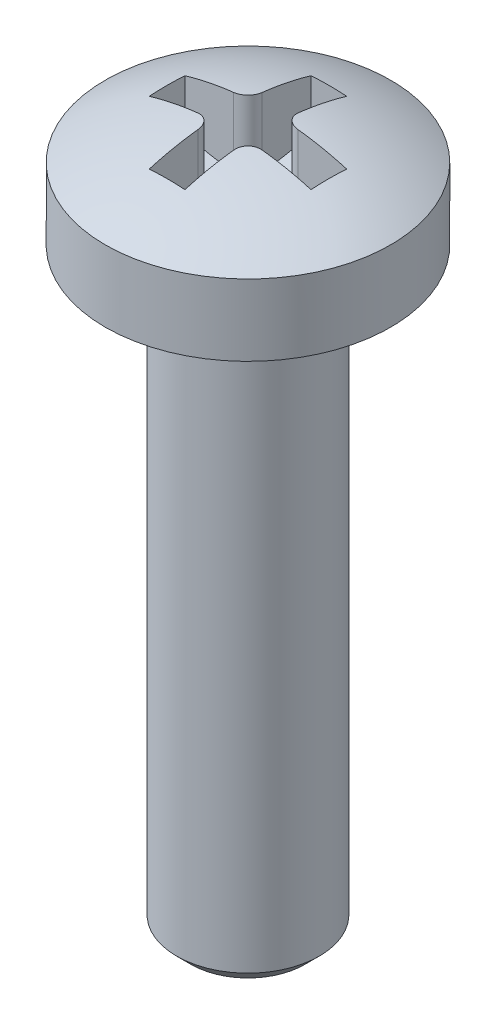
ISO-10303-21;
HEADER;
FILE_DESCRIPTION(('STEP AP214'),'2;1');
FILE_NAME('part.step','',(''),(''),'','','');
FILE_SCHEMA(('AUTOMOTIVE_DESIGN { 1 0 10303 214 1 1 1 1 }'));
ENDSEC;
DATA;
#1=APPLICATION_CONTEXT('core data for automotive mechanical design processes');
#2=APPLICATION_PROTOCOL_DEFINITION('international standard','automotive_design',2000,#1);
#3=PRODUCT_CONTEXT('',#1,'mechanical');
#4=PRODUCT('Part','Part','',(#3));
#5=PRODUCT_RELATED_PRODUCT_CATEGORY('part','',(#4));
#6=PRODUCT_DEFINITION_FORMATION('','',#4);
#7=PRODUCT_DEFINITION_CONTEXT('part definition',#1,'design');
#8=PRODUCT_DEFINITION('design','',#6,#7);
#9=PRODUCT_DEFINITION_SHAPE('','',#8);
#10=(LENGTH_UNIT() NAMED_UNIT(*) SI_UNIT(.MILLI.,.METRE.));
#11=(NAMED_UNIT(*) PLANE_ANGLE_UNIT() SI_UNIT($,.RADIAN.));
#12=(NAMED_UNIT(*) SI_UNIT($,.STERADIAN.) SOLID_ANGLE_UNIT());
#13=UNCERTAINTY_MEASURE_WITH_UNIT(LENGTH_MEASURE(1.E-05),#10,'distance_accuracy_value','');
#14=(GEOMETRIC_REPRESENTATION_CONTEXT(3) GLOBAL_UNCERTAINTY_ASSIGNED_CONTEXT((#13)) GLOBAL_UNIT_ASSIGNED_CONTEXT((#10,
#11,#12)) REPRESENTATION_CONTEXT('',''));
#15=CARTESIAN_POINT('',(0.,0.,0.));
#16=DIRECTION('',(0.,0.,1.));
#17=DIRECTION('',(1.,0.,0.));
#18=AXIS2_PLACEMENT_3D('',#15,#16,#17);
#19=CARTESIAN_POINT('',(3.,-25.,0.));
#20=DIRECTION('',(0.,1.,0.));
#21=DIRECTION('',(0.,0.,1.));
#22=AXIS2_PLACEMENT_3D('',#19,#20,#21);
#23=PLANE('',#22);
#24=CARTESIAN_POINT('',(0.,-25.,0.));
#25=DIRECTION('',(0.,1.,0.));
#26=DIRECTION('',(0.,0.,1.));
#27=AXIS2_PLACEMENT_3D('',#24,#25,#26);
#28=CIRCLE('',#27,2.40000000000001);
#29=CARTESIAN_POINT('',(0.,-25.,2.40000000000001));
#30=VERTEX_POINT('',#29);
#31=EDGE_CURVE('E11',#30,#30,#28,.F.);
#32=ORIENTED_EDGE('',*,*,#31,.T.);
#33=EDGE_LOOP('',(#32));
#34=FACE_BOUND('',#33,.T.);
#35=ADVANCED_FACE('F36',(#34),#23,.F.);
#36=CARTESIAN_POINT('',(0.,-7.44999999999999,0.));
#37=DIRECTION('',(0.,1.,0.));
#38=DIRECTION('',(1.,0.,0.));
#39=AXIS2_PLACEMENT_3D('',#36,#37,#38);
#40=SPHERICAL_SURFACE('',#39,12.05);
#41=CARTESIAN_POINT('',(0.75,-7.44999999999999,0.));
#42=DIRECTION('',(1.,0.,0.));
#43=DIRECTION('',(0.,0.,-1.));
#44=AXIS2_PLACEMENT_3D('',#41,#42,#43);
#45=CIRCLE('',#44,12.0266371026983);
#46=CARTESIAN_POINT('',(0.75,4.08603051313579,-3.4));
#47=VERTEX_POINT('',#46);
#48=CARTESIAN_POINT('',(0.75,4.50062759858243,-1.35));
#49=VERTEX_POINT('',#48);
#50=EDGE_CURVE('E194',#47,#49,#45,.T.);
#51=ORIENTED_EDGE('',*,*,#50,.T.);
#52=CARTESIAN_POINT('',(0.75,4.50062759858243,-1.35));
#53=CARTESIAN_POINT('',(0.749970698872697,4.50440889012492,-1.31655591255039));
#54=CARTESIAN_POINT('',(0.752794798026864,4.50786991911377,-1.28307795509376));
#55=CARTESIAN_POINT('',(0.763975275297831,4.51406552358367,-1.21700468922484));
#56=CARTESIAN_POINT('',(0.772329233355664,4.51680041611411,-1.18440900119309));
#57=CARTESIAN_POINT('',(0.79440353509289,4.52146303861642,-1.12099578071274));
#58=CARTESIAN_POINT('',(0.808127936309649,4.52339015600345,-1.09017961299683));
#59=CARTESIAN_POINT('',(0.840557266614517,4.52637706033217,-1.03125561276694));
#60=CARTESIAN_POINT('',(0.8592606546155,4.52743711523272,-1.00314694589195));
#61=CARTESIAN_POINT('',(0.900979469558403,4.52865432624304,-0.95062827208944));
#62=CARTESIAN_POINT('',(0.923964554523091,4.52881760325255,-0.926194301302964));
#63=CARTESIAN_POINT('',(0.973678414753883,4.52825275812473,-0.881492303520661));
#64=CARTESIAN_POINT('',(1.00040776840153,4.52752449813588,-0.861224921338421));
#65=CARTESIAN_POINT('',(1.05675110369052,4.52520195501556,-0.825485736308251));
#66=CARTESIAN_POINT('',(1.08635633111687,4.52361023640853,-0.809999944511885));
#67=CARTESIAN_POINT('',(1.14767285065154,4.51960909198419,-0.78416498760138));
#68=CARTESIAN_POINT('',(1.17938331676325,4.51719998536419,-0.773813821249108));
#69=CARTESIAN_POINT('',(1.23437039023693,4.51246564112583,-0.760785009950145));
#70=CARTESIAN_POINT('',(1.25734967707357,4.51032865006867,-0.756740661571654));
#71=CARTESIAN_POINT('',(1.30355584224305,4.50572101643025,-0.751347964421718));
#72=CARTESIAN_POINT('',(1.3267823190226,4.50325085589045,-0.749995764296765));
#73=CARTESIAN_POINT('',(1.35,4.50062759858243,-0.75));
#74=B_SPLINE_CURVE_WITH_KNOTS('',3,(#52,#53,#54,#55,#56,#57,#58,#59,#60,#61,#62,#63,#64,#65,#66,
#67,#68,#69,#70,#71,#72,#73),.UNSPECIFIED.,.F.,.F.,(4,2,2,2,2,2,2,2,2,2,4),(0.,
0.100848616189047,0.201653126662501,0.302533945598312,0.403383576314152,0.503544000910255,
0.603719914500104,0.703599915669478,0.803440957613562,0.873581021054327,0.943620670692784),.UNSPECIFIED.);
#75=CARTESIAN_POINT('',(1.35,4.50062759858243,-0.75));
#76=VERTEX_POINT('',#75);
#77=EDGE_CURVE('E256',#49,#76,#74,.T.);
#78=ORIENTED_EDGE('',*,*,#77,.T.);
#79=CARTESIAN_POINT('',(0.,-7.44999999999999,-0.75));
#80=DIRECTION('',(0.,0.,-1.));
#81=DIRECTION('',(-1.,0.,0.));
#82=AXIS2_PLACEMENT_3D('',#79,#80,#81);
#83=CIRCLE('',#82,12.0266371026983);
#84=CARTESIAN_POINT('',(3.4,4.08603051313579,-0.75));
#85=VERTEX_POINT('',#84);
#86=EDGE_CURVE('E192',#76,#85,#83,.T.);
#87=ORIENTED_EDGE('',*,*,#86,.T.);
#88=CARTESIAN_POINT('',(3.4,-7.44999999999999,0.));
#89=DIRECTION('',(1.,0.,0.));
#90=DIRECTION('',(0.,0.,-1.));
#91=AXIS2_PLACEMENT_3D('',#88,#89,#90);
#92=CIRCLE('',#91,11.5603849416877);
#93=CARTESIAN_POINT('',(3.4,4.08603051313579,0.75));
#94=VERTEX_POINT('',#93);
#95=EDGE_CURVE('E169',#85,#94,#92,.T.);
#96=ORIENTED_EDGE('',*,*,#95,.T.);
#97=CARTESIAN_POINT('',(0.,-7.44999999999999,0.75));
#98=DIRECTION('',(0.,0.,1.));
#99=DIRECTION('',(1.,0.,0.));
#100=AXIS2_PLACEMENT_3D('',#97,#98,#99);
#101=CIRCLE('',#100,12.0266371026983);
#102=CARTESIAN_POINT('',(1.35,4.50062759858243,0.75));
#103=VERTEX_POINT('',#102);
#104=EDGE_CURVE('E218',#94,#103,#101,.T.);
#105=ORIENTED_EDGE('',*,*,#104,.T.);
#106=CARTESIAN_POINT('',(1.35,4.50062759858243,0.75));
#107=CARTESIAN_POINT('',(1.31655591255039,4.50440889012492,0.749970698872697));
#108=CARTESIAN_POINT('',(1.28307795509376,4.50786991911377,0.752794798026864));
#109=CARTESIAN_POINT('',(1.21700468922484,4.51406552358367,0.763975275297831));
#110=CARTESIAN_POINT('',(1.18440900119309,4.51680041611411,0.772329233355664));
#111=CARTESIAN_POINT('',(1.12099578071274,4.52146303861642,0.79440353509289));
#112=CARTESIAN_POINT('',(1.09017961299683,4.52339015600345,0.808127936309649));
#113=CARTESIAN_POINT('',(1.03125561276694,4.52637706033217,0.840557266614517));
#114=CARTESIAN_POINT('',(1.00314694589195,4.52743711523272,0.8592606546155));
#115=CARTESIAN_POINT('',(0.95062827208944,4.52865432624304,0.900979469558403));
#116=CARTESIAN_POINT('',(0.926194301302965,4.52881760325255,0.923964554523091));
#117=CARTESIAN_POINT('',(0.881492303520662,4.52825275812473,0.973678414753883));
#118=CARTESIAN_POINT('',(0.861224921338422,4.52752449813588,1.00040776840153));
#119=CARTESIAN_POINT('',(0.825485736308252,4.52520195501556,1.05675110369052));
#120=CARTESIAN_POINT('',(0.809999944511885,4.52361023640853,1.08635633111687));
#121=CARTESIAN_POINT('',(0.784164987601381,4.51960909198419,1.14767285065154));
#122=CARTESIAN_POINT('',(0.773813821249109,4.51719998536419,1.17938331676325));
#123=CARTESIAN_POINT('',(0.760785009950146,4.51246564112583,1.23437039023693));
#124=CARTESIAN_POINT('',(0.756740661571655,4.51032865006867,1.25734967707357));
#125=CARTESIAN_POINT('',(0.751347964421719,4.50572101643025,1.30355584224305));
#126=CARTESIAN_POINT('',(0.749995764296766,4.50325085589045,1.3267823190226));
#127=CARTESIAN_POINT('',(0.750000000000001,4.50062759858243,1.35));
#128=B_SPLINE_CURVE_WITH_KNOTS('',3,(#106,#107,#108,#109,#110,#111,#112,#113,#114,#115,#116,
#117,#118,#119,#120,#121,#122,#123,#124,#125,#126,#127),.UNSPECIFIED.,.F.,.F.,(4,2,2,2,2,2,2,2,
2,2,4),(0.,0.100848616189047,0.201653126662501,0.302533945598312,0.403383576314151,
0.503544000910255,0.603719914500104,0.703599915669478,0.803440957613562,0.873581021054327,
0.943620670692784),.UNSPECIFIED.);
#129=CARTESIAN_POINT('',(0.75,4.50062759858243,1.35));
#130=VERTEX_POINT('',#129);
#131=EDGE_CURVE('E251',#103,#130,#128,.T.);
#132=ORIENTED_EDGE('',*,*,#131,.T.);
#133=CARTESIAN_POINT('',(0.75,-7.44999999999999,0.));
#134=DIRECTION('',(1.,0.,0.));
#135=DIRECTION('',(0.,0.,-1.));
#136=AXIS2_PLACEMENT_3D('',#133,#134,#135);
#137=CIRCLE('',#136,12.0266371026983);
#138=CARTESIAN_POINT('',(0.750000000000001,4.08603051313579,3.4));
#139=VERTEX_POINT('',#138);
#140=EDGE_CURVE('E216',#130,#139,#137,.T.);
#141=ORIENTED_EDGE('',*,*,#140,.T.);
#142=CARTESIAN_POINT('',(0.,-7.44999999999999,3.4));
#143=DIRECTION('',(0.,0.,1.));
#144=DIRECTION('',(1.,0.,0.));
#145=AXIS2_PLACEMENT_3D('',#142,#143,#144);
#146=CIRCLE('',#145,11.5603849416877);
#147=CARTESIAN_POINT('',(-0.75,4.08603051313579,3.4));
#148=VERTEX_POINT('',#147);
#149=EDGE_CURVE('E213',#139,#148,#146,.T.);
#150=ORIENTED_EDGE('',*,*,#149,.T.);
#151=CARTESIAN_POINT('',(-0.75,-7.44999999999999,0.));
#152=DIRECTION('',(-1.,0.,0.));
#153=DIRECTION('',(0.,0.,1.));
#154=AXIS2_PLACEMENT_3D('',#151,#152,#153);
#155=CIRCLE('',#154,12.0266371026983);
#156=CARTESIAN_POINT('',(-0.75,4.50062759858243,1.35));
#157=VERTEX_POINT('',#156);
#158=EDGE_CURVE('E210',#148,#157,#155,.T.);
#159=ORIENTED_EDGE('',*,*,#158,.T.);
#160=CARTESIAN_POINT('',(-0.75,4.50062759858243,1.35));
#161=CARTESIAN_POINT('',(-0.749970698872696,4.50440889012492,1.31655591255039));
#162=CARTESIAN_POINT('',(-0.752794798026864,4.50786991911377,1.28307795509376));
#163=CARTESIAN_POINT('',(-0.763975275297831,4.51406552358367,1.21700468922484));
#164=CARTESIAN_POINT('',(-0.772329233355664,4.51680041611411,1.18440900119309));
#165=CARTESIAN_POINT('',(-0.794403535092889,4.52146303861642,1.12099578071274));
#166=CARTESIAN_POINT('',(-0.808127936309649,4.52339015600345,1.09017961299683));
#167=CARTESIAN_POINT('',(-0.840557266614517,4.52637706033217,1.03125561276694));
#168=CARTESIAN_POINT('',(-0.8592606546155,4.52743711523272,1.00314694589195));
#169=CARTESIAN_POINT('',(-0.900979469558402,4.52865432624304,0.95062827208944));
#170=CARTESIAN_POINT('',(-0.923964554523091,4.52881760325255,0.926194301302964));
#171=CARTESIAN_POINT('',(-0.973678414753883,4.52825275812473,0.881492303520661));
#172=CARTESIAN_POINT('',(-1.00040776840153,4.52752449813588,0.861224921338422));
#173=CARTESIAN_POINT('',(-1.05675110369052,4.52520195501556,0.825485736308252));
#174=CARTESIAN_POINT('',(-1.08635633111687,4.52361023640853,0.809999944511885));
#175=CARTESIAN_POINT('',(-1.14767285065154,4.51960909198419,0.78416498760138));
#176=CARTESIAN_POINT('',(-1.17938331676325,4.51719998536419,0.773813821249109));
#177=CARTESIAN_POINT('',(-1.23437039023693,4.51246564112583,0.760785009950145));
#178=CARTESIAN_POINT('',(-1.25734967707357,4.51032865006867,0.756740661571655));
#179=CARTESIAN_POINT('',(-1.30355584224305,4.50572101643025,0.751347964421718));
#180=CARTESIAN_POINT('',(-1.3267823190226,4.50325085589045,0.749995764296765));
#181=CARTESIAN_POINT('',(-1.35,4.50062759858243,0.75));
#182=B_SPLINE_CURVE_WITH_KNOTS('',3,(#160,#161,#162,#163,#164,#165,#166,#167,#168,#169,#170,
#171,#172,#173,#174,#175,#176,#177,#178,#179,#180,#181),.UNSPECIFIED.,.F.,.F.,(4,2,2,2,2,2,2,2,
2,2,4),(0.,0.100848616189047,0.201653126662501,0.302533945598312,0.403383576314152,
0.503544000910255,0.603719914500104,0.703599915669478,0.803440957613562,0.873581021054327,
0.943620670692784),.UNSPECIFIED.);
#183=CARTESIAN_POINT('',(-1.35,4.50062759858243,0.75));
#184=VERTEX_POINT('',#183);
#185=EDGE_CURVE('E230',#157,#184,#182,.T.);
#186=ORIENTED_EDGE('',*,*,#185,.T.);
#187=CARTESIAN_POINT('',(0.,-7.44999999999999,0.75));
#188=DIRECTION('',(0.,0.,1.));
#189=DIRECTION('',(1.,0.,0.));
#190=AXIS2_PLACEMENT_3D('',#187,#188,#189);
#191=CIRCLE('',#190,12.0266371026983);
#192=CARTESIAN_POINT('',(-3.4,4.08603051313579,0.75));
#193=VERTEX_POINT('',#192);
#194=EDGE_CURVE('E208',#184,#193,#191,.T.);
#195=ORIENTED_EDGE('',*,*,#194,.T.);
#196=CARTESIAN_POINT('',(-3.4,-7.44999999999999,0.));
#197=DIRECTION('',(-1.,0.,0.));
#198=DIRECTION('',(0.,0.,1.));
#199=AXIS2_PLACEMENT_3D('',#196,#197,#198);
#200=CIRCLE('',#199,11.5603849416877);
#201=CARTESIAN_POINT('',(-3.4,4.08603051313579,-0.75));
#202=VERTEX_POINT('',#201);
#203=EDGE_CURVE('E205',#193,#202,#200,.T.);
#204=ORIENTED_EDGE('',*,*,#203,.T.);
#205=CARTESIAN_POINT('',(0.,-7.44999999999999,-0.75));
#206=DIRECTION('',(0.,0.,-1.));
#207=DIRECTION('',(-1.,0.,0.));
#208=AXIS2_PLACEMENT_3D('',#205,#206,#207);
#209=CIRCLE('',#208,12.0266371026983);
#210=CARTESIAN_POINT('',(-1.35,4.50062759858243,-0.75));
#211=VERTEX_POINT('',#210);
#212=EDGE_CURVE('E202',#202,#211,#209,.T.);
#213=ORIENTED_EDGE('',*,*,#212,.T.);
#214=CARTESIAN_POINT('',(-1.35,4.50062759858243,-0.75));
#215=CARTESIAN_POINT('',(-1.31655591255039,4.50440889012492,-0.749970698872696));
#216=CARTESIAN_POINT('',(-1.28307795509376,4.50786991911377,-0.752794798026864));
#217=CARTESIAN_POINT('',(-1.21700468922484,4.51406552358367,-0.763975275297831));
#218=CARTESIAN_POINT('',(-1.18440900119309,4.51680041611411,-0.772329233355664));
#219=CARTESIAN_POINT('',(-1.12099578071274,4.52146303861642,-0.794403535092889));
#220=CARTESIAN_POINT('',(-1.09017961299683,4.52339015600345,-0.808127936309649));
#221=CARTESIAN_POINT('',(-1.03125561276694,4.52637706033217,-0.840557266614517));
#222=CARTESIAN_POINT('',(-1.00314694589195,4.52743711523272,-0.8592606546155));
#223=CARTESIAN_POINT('',(-0.95062827208944,4.52865432624304,-0.900979469558402));
#224=CARTESIAN_POINT('',(-0.926194301302964,4.52881760325255,-0.923964554523091));
#225=CARTESIAN_POINT('',(-0.881492303520661,4.52825275812473,-0.973678414753883));
#226=CARTESIAN_POINT('',(-0.861224921338422,4.52752449813588,-1.00040776840153));
#227=CARTESIAN_POINT('',(-0.825485736308252,4.52520195501556,-1.05675110369052));
#228=CARTESIAN_POINT('',(-0.809999944511885,4.52361023640853,-1.08635633111687));
#229=CARTESIAN_POINT('',(-0.78416498760138,4.51960909198419,-1.14767285065154));
#230=CARTESIAN_POINT('',(-0.773813821249109,4.51719998536419,-1.17938331676325));
#231=CARTESIAN_POINT('',(-0.760785009950145,4.51246564112583,-1.23437039023693));
#232=CARTESIAN_POINT('',(-0.756740661571655,4.51032865006867,-1.25734967707357));
#233=CARTESIAN_POINT('',(-0.751347964421718,4.50572101643025,-1.30355584224305));
#234=CARTESIAN_POINT('',(-0.749995764296765,4.50325085589045,-1.3267823190226));
#235=CARTESIAN_POINT('',(-0.75,4.50062759858243,-1.35));
#236=B_SPLINE_CURVE_WITH_KNOTS('',3,(#214,#215,#216,#217,#218,#219,#220,#221,#222,#223,#224,
#225,#226,#227,#228,#229,#230,#231,#232,#233,#234,#235),.UNSPECIFIED.,.F.,.F.,(4,2,2,2,2,2,2,2,
2,2,4),(0.,0.100848616189047,0.201653126662501,0.302533945598312,0.403383576314151,
0.503544000910255,0.603719914500104,0.703599915669478,0.803440957613562,0.873581021054327,
0.943620670692784),.UNSPECIFIED.);
#237=CARTESIAN_POINT('',(-0.75,4.50062759858243,-1.35));
#238=VERTEX_POINT('',#237);
#239=EDGE_CURVE('E224',#211,#238,#236,.T.);
#240=ORIENTED_EDGE('',*,*,#239,.T.);
#241=CARTESIAN_POINT('',(-0.75,-7.44999999999999,0.));
#242=DIRECTION('',(-1.,0.,0.));
#243=DIRECTION('',(0.,0.,1.));
#244=AXIS2_PLACEMENT_3D('',#241,#242,#243);
#245=CIRCLE('',#244,12.0266371026983);
#246=CARTESIAN_POINT('',(-0.75,4.08603051313579,-3.4));
#247=VERTEX_POINT('',#246);
#248=EDGE_CURVE('E200',#238,#247,#245,.T.);
#249=ORIENTED_EDGE('',*,*,#248,.T.);
#250=CARTESIAN_POINT('',(0.,-7.44999999999999,-3.4));
#251=DIRECTION('',(0.,0.,-1.));
#252=DIRECTION('',(-1.,0.,0.));
#253=AXIS2_PLACEMENT_3D('',#250,#251,#252);
#254=CIRCLE('',#253,11.5603849416877);
#255=EDGE_CURVE('E197',#247,#47,#254,.T.);
#256=ORIENTED_EDGE('',*,*,#255,.T.);
#257=EDGE_LOOP('',(#51,#78,#87,#96,#105,#132,#141,#150,#159,#186,#195,#204,#213,#240,#249,#256));
#258=FACE_BOUND('',#257,.T.);
#259=CARTESIAN_POINT('',(0.,3.,0.));
#260=DIRECTION('',(0.,1.,0.));
#261=DIRECTION('',(0.,0.,1.));
#262=AXIS2_PLACEMENT_3D('',#259,#260,#261);
#263=CIRCLE('',#262,6.);
#264=CARTESIAN_POINT('',(0.,3.,6.));
#265=VERTEX_POINT('',#264);
#266=EDGE_CURVE('E188',#265,#265,#263,.T.);
#267=ORIENTED_EDGE('',*,*,#266,.T.);
#268=EDGE_LOOP('',(#267));
#269=FACE_BOUND('',#268,.T.);
#270=ADVANCED_FACE('F238',(#258,#269),#40,.T.);
#271=CARTESIAN_POINT('',(0.,4.6,0.));
#272=DIRECTION('',(0.,1.,0.));
#273=DIRECTION('',(0.,0.,1.));
#274=AXIS2_PLACEMENT_3D('',#271,#272,#273);
#275=CYLINDRICAL_SURFACE('',#274,6.);
#276=ORIENTED_EDGE('',*,*,#266,.F.);
#277=EDGE_LOOP('',(#276));
#278=FACE_BOUND('',#277,.T.);
#279=CARTESIAN_POINT('',(0.,0.,0.));
#280=DIRECTION('',(0.,1.,0.));
#281=DIRECTION('',(0.,0.,1.));
#282=AXIS2_PLACEMENT_3D('',#279,#280,#281);
#283=CIRCLE('',#282,6.);
#284=CARTESIAN_POINT('',(0.,0.,6.));
#285=VERTEX_POINT('',#284);
#286=EDGE_CURVE('E180',#285,#285,#283,.T.);
#287=ORIENTED_EDGE('',*,*,#286,.T.);
#288=EDGE_LOOP('',(#287));
#289=FACE_BOUND('',#288,.T.);
#290=ADVANCED_FACE('F243',(#278,#289),#275,.T.);
#291=CARTESIAN_POINT('',(6.,0.,0.));
#292=DIRECTION('',(0.,1.,0.));
#293=DIRECTION('',(0.,0.,1.));
#294=AXIS2_PLACEMENT_3D('',#291,#292,#293);
#295=PLANE('',#294);
#296=ORIENTED_EDGE('',*,*,#286,.F.);
#297=EDGE_LOOP('',(#296));
#298=FACE_BOUND('',#297,.T.);
#299=CARTESIAN_POINT('',(0.,0.,0.));
#300=DIRECTION('',(0.,1.,0.));
#301=DIRECTION('',(0.,0.,1.));
#302=AXIS2_PLACEMENT_3D('',#299,#300,#301);
#303=CIRCLE('',#302,3.);
#304=CARTESIAN_POINT('',(0.,0.,3.));
#305=VERTEX_POINT('',#304);
#306=EDGE_CURVE('E177',#305,#305,#303,.T.);
#307=ORIENTED_EDGE('',*,*,#306,.T.);
#308=EDGE_LOOP('',(#307));
#309=FACE_BOUND('',#308,.T.);
#310=ADVANCED_FACE('F330',(#298,#309),#295,.F.);
#311=CARTESIAN_POINT('',(0.,4.6,0.));
#312=DIRECTION('',(0.,1.,0.));
#313=DIRECTION('',(0.,0.,1.));
#314=AXIS2_PLACEMENT_3D('',#311,#312,#313);
#315=CYLINDRICAL_SURFACE('',#314,3.);
#316=CARTESIAN_POINT('',(0.,-24.4,0.));
#317=DIRECTION('',(0.,1.,0.));
#318=DIRECTION('',(0.,0.,1.));
#319=AXIS2_PLACEMENT_3D('',#316,#317,#318);
#320=CIRCLE('',#319,3.);
#321=CARTESIAN_POINT('',(0.,-24.4,3.));
#322=VERTEX_POINT('',#321);
#323=EDGE_CURVE('E44',#322,#322,#320,.T.);
#324=ORIENTED_EDGE('',*,*,#323,.T.);
#325=EDGE_LOOP('',(#324));
#326=FACE_BOUND('',#325,.T.);
#327=ORIENTED_EDGE('',*,*,#306,.F.);
#328=EDGE_LOOP('',(#327));
#329=FACE_BOUND('',#328,.T.);
#330=ADVANCED_FACE('F302',(#326,#329),#315,.T.);
#331=CARTESIAN_POINT('',(0.75,-25.001,0.75));
#332=DIRECTION('',(0.,0.,1.));
#333=DIRECTION('',(1.,0.,0.));
#334=AXIS2_PLACEMENT_3D('',#331,#332,#333);
#335=PLANE('',#334);
#336=CARTESIAN_POINT('',(0.,14.25,0.75));
#337=DIRECTION('',(0.,0.,1.));
#338=DIRECTION('',(1.,0.,0.));
#339=AXIS2_PLACEMENT_3D('',#336,#337,#338);
#340=CIRCLE('',#339,12.7279220613579);
#341=CARTESIAN_POINT('',(3.4,1.98460151483043,0.75));
#342=VERTEX_POINT('',#341);
#343=CARTESIAN_POINT('',(1.35,1.59387500061729,0.75));
#344=VERTEX_POINT('',#343);
#345=EDGE_CURVE('E175',#342,#344,#340,.F.);
#346=ORIENTED_EDGE('',*,*,#345,.T.);
#347=DIRECTION('',(0.,1.,0.));
#348=VECTOR('',#347,1.);
#349=CARTESIAN_POINT('',(1.35,-25.001,0.75));
#350=LINE('',#349,#348);
#351=EDGE_CURVE('E555',#344,#103,#350,.T.);
#352=ORIENTED_EDGE('',*,*,#351,.T.);
#353=ORIENTED_EDGE('',*,*,#104,.F.);
#354=DIRECTION('',(0.,1.,0.));
#355=VECTOR('',#354,1.);
#356=CARTESIAN_POINT('',(3.4,-25.001,0.75));
#357=LINE('',#356,#355);
#358=EDGE_CURVE('E171',#342,#94,#357,.T.);
#359=ORIENTED_EDGE('',*,*,#358,.F.);
#360=EDGE_LOOP('',(#346,#352,#353,#359));
#361=FACE_BOUND('',#360,.T.);
#362=ADVANCED_FACE('F343',(#361),#335,.F.);
#363=CARTESIAN_POINT('',(0.75,-25.001,0.75));
#364=DIRECTION('',(1.,0.,0.));
#365=DIRECTION('',(0.,0.,-1.));
#366=AXIS2_PLACEMENT_3D('',#363,#364,#365);
#367=PLANE('',#366);
#368=ORIENTED_EDGE('',*,*,#140,.F.);
#369=DIRECTION('',(0.,1.,0.));
#370=VECTOR('',#369,1.);
#371=CARTESIAN_POINT('',(0.75,-25.001,1.35));
#372=LINE('',#371,#370);
#373=CARTESIAN_POINT('',(0.75,1.59387500061729,1.35));
#374=VERTEX_POINT('',#373);
#375=EDGE_CURVE('E553',#130,#374,#372,.F.);
#376=ORIENTED_EDGE('',*,*,#375,.T.);
#377=CARTESIAN_POINT('',(0.75,14.25,0.));
#378=DIRECTION('',(1.,0.,0.));
#379=DIRECTION('',(0.,0.,-1.));
#380=AXIS2_PLACEMENT_3D('',#377,#378,#379);
#381=CIRCLE('',#380,12.7279220613579);
#382=CARTESIAN_POINT('',(0.750000000000001,1.98460151483043,3.4));
#383=VERTEX_POINT('',#382);
#384=EDGE_CURVE('E182',#374,#383,#381,.F.);
#385=ORIENTED_EDGE('',*,*,#384,.T.);
#386=DIRECTION('',(0.,1.,0.));
#387=VECTOR('',#386,1.);
#388=CARTESIAN_POINT('',(0.750000000000001,-25.001,3.4));
#389=LINE('',#388,#387);
#390=EDGE_CURVE('E161',#383,#139,#389,.T.);
#391=ORIENTED_EDGE('',*,*,#390,.T.);
#392=EDGE_LOOP('',(#368,#376,#385,#391));
#393=FACE_BOUND('',#392,.T.);
#394=ADVANCED_FACE('F291',(#393),#367,.F.);
#395=CARTESIAN_POINT('',(-0.75,-25.001,3.4));
#396=DIRECTION('',(0.,0.,1.));
#397=DIRECTION('',(1.,0.,0.));
#398=AXIS2_PLACEMENT_3D('',#395,#396,#397);
#399=PLANE('',#398);
#400=ORIENTED_EDGE('',*,*,#390,.F.);
#401=CARTESIAN_POINT('',(0.,14.25,3.4));
#402=DIRECTION('',(0.,0.,1.));
#403=DIRECTION('',(1.,0.,0.));
#404=AXIS2_PLACEMENT_3D('',#401,#402,#403);
#405=CIRCLE('',#404,12.2883074505808);
#406=CARTESIAN_POINT('',(-0.75,1.98460151483043,3.4));
#407=VERTEX_POINT('',#406);
#408=EDGE_CURVE('E517',#383,#407,#405,.F.);
#409=ORIENTED_EDGE('',*,*,#408,.T.);
#410=DIRECTION('',(0.,1.,0.));
#411=VECTOR('',#410,1.);
#412=CARTESIAN_POINT('',(-0.75,-25.001,3.4));
#413=LINE('',#412,#411);
#414=EDGE_CURVE('E516',#407,#148,#413,.T.);
#415=ORIENTED_EDGE('',*,*,#414,.T.);
#416=ORIENTED_EDGE('',*,*,#149,.F.);
#417=EDGE_LOOP('',(#400,#409,#415,#416));
#418=FACE_BOUND('',#417,.T.);
#419=ADVANCED_FACE('F356',(#418),#399,.F.);
#420=CARTESIAN_POINT('',(-0.75,-25.001,0.75));
#421=DIRECTION('',(-1.,0.,0.));
#422=DIRECTION('',(0.,0.,1.));
#423=AXIS2_PLACEMENT_3D('',#420,#421,#422);
#424=PLANE('',#423);
#425=CARTESIAN_POINT('',(-0.75,14.25,0.));
#426=DIRECTION('',(-1.,0.,0.));
#427=DIRECTION('',(0.,0.,1.));
#428=AXIS2_PLACEMENT_3D('',#425,#426,#427);
#429=CIRCLE('',#428,12.7279220613579);
#430=CARTESIAN_POINT('',(-0.75,1.59387500061729,1.35));
#431=VERTEX_POINT('',#430);
#432=EDGE_CURVE('E511',#407,#431,#429,.F.);
#433=ORIENTED_EDGE('',*,*,#432,.T.);
#434=DIRECTION('',(0.,1.,0.));
#435=VECTOR('',#434,1.);
#436=CARTESIAN_POINT('',(-0.75,-25.001,1.35));
#437=LINE('',#436,#435);
#438=EDGE_CURVE('E506',#431,#157,#437,.T.);
#439=ORIENTED_EDGE('',*,*,#438,.T.);
#440=ORIENTED_EDGE('',*,*,#158,.F.);
#441=ORIENTED_EDGE('',*,*,#414,.F.);
#442=EDGE_LOOP('',(#433,#439,#440,#441));
#443=FACE_BOUND('',#442,.T.);
#444=ADVANCED_FACE('F363',(#443),#424,.F.);
#445=CARTESIAN_POINT('',(-3.4,-25.001,0.75));
#446=DIRECTION('',(0.,0.,1.));
#447=DIRECTION('',(1.,0.,0.));
#448=AXIS2_PLACEMENT_3D('',#445,#446,#447);
#449=PLANE('',#448);
#450=ORIENTED_EDGE('',*,*,#194,.F.);
#451=DIRECTION('',(0.,1.,0.));
#452=VECTOR('',#451,1.);
#453=CARTESIAN_POINT('',(-1.35,-25.001,0.75));
#454=LINE('',#453,#452);
#455=CARTESIAN_POINT('',(-1.35,1.59387500061729,0.75));
#456=VERTEX_POINT('',#455);
#457=EDGE_CURVE('E504',#184,#456,#454,.F.);
#458=ORIENTED_EDGE('',*,*,#457,.T.);
#459=CARTESIAN_POINT('',(0.,14.25,0.75));
#460=DIRECTION('',(0.,0.,1.));
#461=DIRECTION('',(1.,0.,0.));
#462=AXIS2_PLACEMENT_3D('',#459,#460,#461);
#463=CIRCLE('',#462,12.7279220613579);
#464=CARTESIAN_POINT('',(-3.4,1.98460151483043,0.75));
#465=VERTEX_POINT('',#464);
#466=EDGE_CURVE('E514',#456,#465,#463,.F.);
#467=ORIENTED_EDGE('',*,*,#466,.T.);
#468=DIRECTION('',(0.,1.,0.));
#469=VECTOR('',#468,1.);
#470=CARTESIAN_POINT('',(-3.4,-25.001,0.75));
#471=LINE('',#470,#469);
#472=EDGE_CURVE('E528',#465,#193,#471,.T.);
#473=ORIENTED_EDGE('',*,*,#472,.T.);
#474=EDGE_LOOP('',(#450,#458,#467,#473));
#475=FACE_BOUND('',#474,.T.);
#476=ADVANCED_FACE('F370',(#475),#449,.F.);
#477=CARTESIAN_POINT('',(-3.4,-25.001,-0.75));
#478=DIRECTION('',(-1.,0.,0.));
#479=DIRECTION('',(0.,0.,1.));
#480=AXIS2_PLACEMENT_3D('',#477,#478,#479);
#481=PLANE('',#480);
#482=ORIENTED_EDGE('',*,*,#472,.F.);
#483=CARTESIAN_POINT('',(-3.4,14.25,0.));
#484=DIRECTION('',(-1.,0.,0.));
#485=DIRECTION('',(0.,0.,1.));
#486=AXIS2_PLACEMENT_3D('',#483,#484,#485);
#487=CIRCLE('',#486,12.2883074505808);
#488=CARTESIAN_POINT('',(-3.4,1.98460151483043,-0.75));
#489=VERTEX_POINT('',#488);
#490=EDGE_CURVE('E520',#465,#489,#487,.F.);
#491=ORIENTED_EDGE('',*,*,#490,.T.);
#492=DIRECTION('',(0.,1.,0.));
#493=VECTOR('',#492,1.);
#494=CARTESIAN_POINT('',(-3.4,-25.001,-0.75));
#495=LINE('',#494,#493);
#496=EDGE_CURVE('E531',#489,#202,#495,.T.);
#497=ORIENTED_EDGE('',*,*,#496,.T.);
#498=ORIENTED_EDGE('',*,*,#203,.F.);
#499=EDGE_LOOP('',(#482,#491,#497,#498));
#500=FACE_BOUND('',#499,.T.);
#501=ADVANCED_FACE('F378',(#500),#481,.F.);
#502=CARTESIAN_POINT('',(-3.4,-25.001,-0.75));
#503=DIRECTION('',(0.,0.,-1.));
#504=DIRECTION('',(-1.,0.,0.));
#505=AXIS2_PLACEMENT_3D('',#502,#503,#504);
#506=PLANE('',#505);
#507=CARTESIAN_POINT('',(0.,14.25,-0.75));
#508=DIRECTION('',(0.,0.,-1.));
#509=DIRECTION('',(-1.,0.,0.));
#510=AXIS2_PLACEMENT_3D('',#507,#508,#509);
#511=CIRCLE('',#510,12.7279220613579);
#512=CARTESIAN_POINT('',(-1.35,1.59387500061729,-0.75));
#513=VERTEX_POINT('',#512);
#514=EDGE_CURVE('E563',#489,#513,#511,.F.);
#515=ORIENTED_EDGE('',*,*,#514,.T.);
#516=DIRECTION('',(0.,1.,0.));
#517=VECTOR('',#516,1.);
#518=CARTESIAN_POINT('',(-1.35,-25.001,-0.75));
#519=LINE('',#518,#517);
#520=EDGE_CURVE('E548',#513,#211,#519,.T.);
#521=ORIENTED_EDGE('',*,*,#520,.T.);
#522=ORIENTED_EDGE('',*,*,#212,.F.);
#523=ORIENTED_EDGE('',*,*,#496,.F.);
#524=EDGE_LOOP('',(#515,#521,#522,#523));
#525=FACE_BOUND('',#524,.T.);
#526=ADVANCED_FACE('F386',(#525),#506,.F.);
#527=CARTESIAN_POINT('',(-0.75,-25.001,-3.4));
#528=DIRECTION('',(-1.,0.,0.));
#529=DIRECTION('',(0.,0.,1.));
#530=AXIS2_PLACEMENT_3D('',#527,#528,#529);
#531=PLANE('',#530);
#532=ORIENTED_EDGE('',*,*,#248,.F.);
#533=DIRECTION('',(0.,1.,0.));
#534=VECTOR('',#533,1.);
#535=CARTESIAN_POINT('',(-0.75,-25.001,-1.35));
#536=LINE('',#535,#534);
#537=CARTESIAN_POINT('',(-0.75,1.59387500061729,-1.35));
#538=VERTEX_POINT('',#537);
#539=EDGE_CURVE('E51',#238,#538,#536,.F.);
#540=ORIENTED_EDGE('',*,*,#539,.T.);
#541=CARTESIAN_POINT('',(-0.75,14.25,0.));
#542=DIRECTION('',(-1.,0.,0.));
#543=DIRECTION('',(0.,0.,1.));
#544=AXIS2_PLACEMENT_3D('',#541,#542,#543);
#545=CIRCLE('',#544,12.7279220613579);
#546=CARTESIAN_POINT('',(-0.75,1.98460151483043,-3.4));
#547=VERTEX_POINT('',#546);
#548=EDGE_CURVE('E559',#538,#547,#545,.F.);
#549=ORIENTED_EDGE('',*,*,#548,.T.);
#550=DIRECTION('',(0.,1.,0.));
#551=VECTOR('',#550,1.);
#552=CARTESIAN_POINT('',(-0.75,-25.001,-3.4));
#553=LINE('',#552,#551);
#554=EDGE_CURVE('E534',#547,#247,#553,.T.);
#555=ORIENTED_EDGE('',*,*,#554,.T.);
#556=EDGE_LOOP('',(#532,#540,#549,#555));
#557=FACE_BOUND('',#556,.T.);
#558=ADVANCED_FACE('F394',(#557),#531,.F.);
#559=CARTESIAN_POINT('',(-0.75,-25.001,-3.4));
#560=DIRECTION('',(0.,0.,-1.));
#561=DIRECTION('',(-1.,0.,0.));
#562=AXIS2_PLACEMENT_3D('',#559,#560,#561);
#563=PLANE('',#562);
#564=ORIENTED_EDGE('',*,*,#554,.F.);
#565=CARTESIAN_POINT('',(0.,14.25,-3.4));
#566=DIRECTION('',(0.,0.,-1.));
#567=DIRECTION('',(-1.,0.,0.));
#568=AXIS2_PLACEMENT_3D('',#565,#566,#567);
#569=CIRCLE('',#568,12.2883074505808);
#570=CARTESIAN_POINT('',(0.75,1.98460151483043,-3.4));
#571=VERTEX_POINT('',#570);
#572=EDGE_CURVE('E542',#547,#571,#569,.F.);
#573=ORIENTED_EDGE('',*,*,#572,.T.);
#574=DIRECTION('',(0.,1.,0.));
#575=VECTOR('',#574,1.);
#576=CARTESIAN_POINT('',(0.75,-25.001,-3.4));
#577=LINE('',#576,#575);
#578=EDGE_CURVE('E170',#571,#47,#577,.T.);
#579=ORIENTED_EDGE('',*,*,#578,.T.);
#580=ORIENTED_EDGE('',*,*,#255,.F.);
#581=EDGE_LOOP('',(#564,#573,#579,#580));
#582=FACE_BOUND('',#581,.T.);
#583=ADVANCED_FACE('F402',(#582),#563,.F.);
#584=CARTESIAN_POINT('',(0.75,-25.001,-3.4));
#585=DIRECTION('',(1.,0.,0.));
#586=DIRECTION('',(0.,0.,-1.));
#587=AXIS2_PLACEMENT_3D('',#584,#585,#586);
#588=PLANE('',#587);
#589=CARTESIAN_POINT('',(0.75,14.25,0.));
#590=DIRECTION('',(1.,0.,0.));
#591=DIRECTION('',(0.,0.,-1.));
#592=AXIS2_PLACEMENT_3D('',#589,#590,#591);
#593=CIRCLE('',#592,12.7279220613579);
#594=CARTESIAN_POINT('',(0.75,1.59387500061729,-1.35));
#595=VERTEX_POINT('',#594);
#596=EDGE_CURVE('E160',#571,#595,#593,.F.);
#597=ORIENTED_EDGE('',*,*,#596,.T.);
#598=DIRECTION('',(0.,1.,0.));
#599=VECTOR('',#598,1.);
#600=CARTESIAN_POINT('',(0.75,-25.001,-1.35));
#601=LINE('',#600,#599);
#602=EDGE_CURVE('E221',#595,#49,#601,.T.);
#603=ORIENTED_EDGE('',*,*,#602,.T.);
#604=ORIENTED_EDGE('',*,*,#50,.F.);
#605=ORIENTED_EDGE('',*,*,#578,.F.);
#606=EDGE_LOOP('',(#597,#603,#604,#605));
#607=FACE_BOUND('',#606,.T.);
#608=ADVANCED_FACE('F409',(#607),#588,.F.);
#609=CARTESIAN_POINT('',(0.75,-25.001,-0.75));
#610=DIRECTION('',(0.,0.,-1.));
#611=DIRECTION('',(-1.,0.,0.));
#612=AXIS2_PLACEMENT_3D('',#609,#610,#611);
#613=PLANE('',#612);
#614=ORIENTED_EDGE('',*,*,#86,.F.);
#615=DIRECTION('',(0.,1.,0.));
#616=VECTOR('',#615,1.);
#617=CARTESIAN_POINT('',(1.35,-25.001,-0.75));
#618=LINE('',#617,#616);
#619=CARTESIAN_POINT('',(1.35,1.59387500061729,-0.75));
#620=VERTEX_POINT('',#619);
#621=EDGE_CURVE('E157',#76,#620,#618,.F.);
#622=ORIENTED_EDGE('',*,*,#621,.T.);
#623=CARTESIAN_POINT('',(0.,14.25,-0.75));
#624=DIRECTION('',(0.,0.,-1.));
#625=DIRECTION('',(-1.,0.,0.));
#626=AXIS2_PLACEMENT_3D('',#623,#624,#625);
#627=CIRCLE('',#626,12.7279220613579);
#628=CARTESIAN_POINT('',(3.4,1.98460151483043,-0.75));
#629=VERTEX_POINT('',#628);
#630=EDGE_CURVE('E151',#620,#629,#627,.F.);
#631=ORIENTED_EDGE('',*,*,#630,.T.);
#632=DIRECTION('',(0.,1.,0.));
#633=VECTOR('',#632,1.);
#634=CARTESIAN_POINT('',(3.4,-25.001,-0.75));
#635=LINE('',#634,#633);
#636=EDGE_CURVE('E155',#629,#85,#635,.T.);
#637=ORIENTED_EDGE('',*,*,#636,.T.);
#638=EDGE_LOOP('',(#614,#622,#631,#637));
#639=FACE_BOUND('',#638,.T.);
#640=ADVANCED_FACE('F154',(#639),#613,.F.);
#641=CARTESIAN_POINT('',(3.4,-25.001,-0.75));
#642=DIRECTION('',(1.,0.,0.));
#643=DIRECTION('',(0.,0.,-1.));
#644=AXIS2_PLACEMENT_3D('',#641,#642,#643);
#645=PLANE('',#644);
#646=ORIENTED_EDGE('',*,*,#636,.F.);
#647=CARTESIAN_POINT('',(3.4,14.25,0.));
#648=DIRECTION('',(1.,0.,0.));
#649=DIRECTION('',(0.,0.,-1.));
#650=AXIS2_PLACEMENT_3D('',#647,#648,#649);
#651=CIRCLE('',#650,12.2883074505808);
#652=EDGE_CURVE('E166',#629,#342,#651,.F.);
#653=ORIENTED_EDGE('',*,*,#652,.T.);
#654=ORIENTED_EDGE('',*,*,#358,.T.);
#655=ORIENTED_EDGE('',*,*,#95,.F.);
#656=EDGE_LOOP('',(#646,#653,#654,#655));
#657=FACE_BOUND('',#656,.T.);
#658=ADVANCED_FACE('F165',(#657),#645,.F.);
#659=CARTESIAN_POINT('',(0.,14.25,0.));
#660=DIRECTION('',(0.,1.,0.));
#661=DIRECTION('',(1.,0.,0.));
#662=AXIS2_PLACEMENT_3D('',#659,#660,#661);
#663=SPHERICAL_SURFACE('',#662,12.75);
#664=ORIENTED_EDGE('',*,*,#345,.F.);
#665=ORIENTED_EDGE('',*,*,#652,.F.);
#666=ORIENTED_EDGE('',*,*,#630,.F.);
#667=CARTESIAN_POINT('',(1.35,1.59387500061729,-0.75));
#668=CARTESIAN_POINT('',(1.31652284276487,1.5903009687478,-0.749970759566994));
#669=CARTESIAN_POINT('',(1.28301630859104,1.58703022329779,-0.75280030485887));
#670=CARTESIAN_POINT('',(1.21689629455382,1.58117634751904,-0.763998510709715));
#671=CARTESIAN_POINT('',(1.18428239823363,1.57859289145738,-0.772364540735062));
#672=CARTESIAN_POINT('',(1.1208428343835,1.57418949071826,-0.794465603435682));
#673=CARTESIAN_POINT('',(1.09001848505085,1.57237010286254,-0.808204537631822));
#674=CARTESIAN_POINT('',(1.03108477880871,1.56955119561983,-0.840663420524428));
#675=CARTESIAN_POINT('',(1.00297462422337,1.56855143470135,-0.859381899670171));
#676=CARTESIAN_POINT('',(0.950438594465174,1.56740474177465,-0.901145792445529));
#677=CARTESIAN_POINT('',(0.925991261890409,1.5672526373452,-0.924164075342866));
#678=CARTESIAN_POINT('',(0.88127195656644,1.5677919591332,-0.973949998329832));
#679=CARTESIAN_POINT('',(0.861000648126992,1.56848351943744,-1.00071823381491));
#680=CARTESIAN_POINT('',(0.825257480659141,1.57068657827399,-1.05715450170529));
#681=CARTESIAN_POINT('',(0.809773233931137,1.5721959321922,-1.08681478379343));
#682=CARTESIAN_POINT('',(0.783956970189638,1.5759891242147,-1.14824743584145));
#683=CARTESIAN_POINT('',(0.773622839413773,1.5782726439304,-1.18001893321699));
#684=CARTESIAN_POINT('',(0.760675437318296,1.58274689944988,-1.23495502524634));
#685=CARTESIAN_POINT('',(0.756672447980788,1.5847569252076,-1.25781739269588));
#686=CARTESIAN_POINT('',(0.751334599337756,1.58908885387147,-1.30378896965228));
#687=CARTESIAN_POINT('',(0.749995931320883,1.59141030650711,-1.32689777925083));
#688=CARTESIAN_POINT('',(0.75,1.59387500061729,-1.35));
#689=B_SPLINE_CURVE_WITH_KNOTS('',3,(#667,#668,#669,#670,#671,#672,#673,#674,#675,#676,#677,
#678,#679,#680,#681,#682,#683,#684,#685,#686,#687,#688),.UNSPECIFIED.,.F.,.F.,(4,2,2,2,2,2,2,2,
2,2,4),(0.,0.100878068713852,0.201708241907484,0.302611769037313,0.403485550745001,
0.503743118476289,0.60401662259491,0.70402842938581,0.803999154450227,0.873742635387148,
0.943386344526418),.UNSPECIFIED.);
#690=EDGE_CURVE('E279',#620,#595,#689,.T.);
#691=ORIENTED_EDGE('',*,*,#690,.T.);
#692=ORIENTED_EDGE('',*,*,#596,.F.);
#693=ORIENTED_EDGE('',*,*,#572,.F.);
#694=ORIENTED_EDGE('',*,*,#548,.F.);
#695=CARTESIAN_POINT('',(-0.75,1.59387500061729,-1.35));
#696=CARTESIAN_POINT('',(-0.749970759566994,1.5903009687478,-1.31652284276487));
#697=CARTESIAN_POINT('',(-0.752800304858871,1.58703022329779,-1.28301630859104));
#698=CARTESIAN_POINT('',(-0.763998510709716,1.58117634751904,-1.21689629455382));
#699=CARTESIAN_POINT('',(-0.772364540735062,1.57859289145738,-1.18428239823363));
#700=CARTESIAN_POINT('',(-0.794465603435682,1.57418949071826,-1.1208428343835));
#701=CARTESIAN_POINT('',(-0.808204537631823,1.57237010286254,-1.09001848505085));
#702=CARTESIAN_POINT('',(-0.840663420524429,1.56955119561983,-1.03108477880871));
#703=CARTESIAN_POINT('',(-0.859381899670171,1.56855143470135,-1.00297462422337));
#704=CARTESIAN_POINT('',(-0.90114579244553,1.56740474177465,-0.950438594465174));
#705=CARTESIAN_POINT('',(-0.924164075342866,1.5672526373452,-0.925991261890408));
#706=CARTESIAN_POINT('',(-0.973949998329833,1.5677919591332,-0.881271956566439));
#707=CARTESIAN_POINT('',(-1.00071823381491,1.56848351943744,-0.861000648126992));
#708=CARTESIAN_POINT('',(-1.05715450170529,1.57068657827399,-0.825257480659141));
#709=CARTESIAN_POINT('',(-1.08681478379343,1.57219593219219,-0.809773233931136));
#710=CARTESIAN_POINT('',(-1.14824743584145,1.57598912421469,-0.783956970189638));
#711=CARTESIAN_POINT('',(-1.18001893321699,1.5782726439304,-0.773622839413773));
#712=CARTESIAN_POINT('',(-1.23495502524634,1.58274689944988,-0.760675437318295));
#713=CARTESIAN_POINT('',(-1.25781739269588,1.58475692520759,-0.756672447980787));
#714=CARTESIAN_POINT('',(-1.30378896965228,1.58908885387147,-0.751334599337755));
#715=CARTESIAN_POINT('',(-1.32689777925083,1.59141030650711,-0.749995931320883));
#716=CARTESIAN_POINT('',(-1.35,1.59387500061729,-0.75));
#717=B_SPLINE_CURVE_WITH_KNOTS('',3,(#695,#696,#697,#698,#699,#700,#701,#702,#703,#704,#705,
#706,#707,#708,#709,#710,#711,#712,#713,#714,#715,#716),.UNSPECIFIED.,.F.,.F.,(4,2,2,2,2,2,2,2,
2,2,4),(0.,0.100878068713852,0.201708241907484,0.302611769037313,0.403485550745002,
0.50374311847629,0.60401662259491,0.70402842938581,0.803999154450227,0.873742635387148,
0.943386344526418),.UNSPECIFIED.);
#718=EDGE_CURVE('E58',#538,#513,#717,.T.);
#719=ORIENTED_EDGE('',*,*,#718,.T.);
#720=ORIENTED_EDGE('',*,*,#514,.F.);
#721=ORIENTED_EDGE('',*,*,#490,.F.);
#722=ORIENTED_EDGE('',*,*,#466,.F.);
#723=CARTESIAN_POINT('',(-1.35,1.59387500061729,0.75));
#724=CARTESIAN_POINT('',(-1.31652284276487,1.5903009687478,0.749970759566994));
#725=CARTESIAN_POINT('',(-1.28301630859104,1.58703022329779,0.752800304858871));
#726=CARTESIAN_POINT('',(-1.21689629455382,1.58117634751904,0.763998510709716));
#727=CARTESIAN_POINT('',(-1.18428239823363,1.57859289145738,0.772364540735062));
#728=CARTESIAN_POINT('',(-1.1208428343835,1.57418949071826,0.794465603435682));
#729=CARTESIAN_POINT('',(-1.09001848505085,1.57237010286254,0.808204537631823));
#730=CARTESIAN_POINT('',(-1.03108477880871,1.56955119561983,0.840663420524429));
#731=CARTESIAN_POINT('',(-1.00297462422337,1.56855143470135,0.859381899670171));
#732=CARTESIAN_POINT('',(-0.950438594465174,1.56740474177465,0.90114579244553));
#733=CARTESIAN_POINT('',(-0.925991261890408,1.5672526373452,0.924164075342866));
#734=CARTESIAN_POINT('',(-0.881271956566439,1.5677919591332,0.973949998329833));
#735=CARTESIAN_POINT('',(-0.861000648126992,1.56848351943744,1.00071823381491));
#736=CARTESIAN_POINT('',(-0.825257480659141,1.57068657827399,1.05715450170529));
#737=CARTESIAN_POINT('',(-0.809773233931136,1.57219593219219,1.08681478379343));
#738=CARTESIAN_POINT('',(-0.783956970189638,1.57598912421469,1.14824743584145));
#739=CARTESIAN_POINT('',(-0.773622839413773,1.5782726439304,1.18001893321699));
#740=CARTESIAN_POINT('',(-0.760675437318296,1.58274689944988,1.23495502524634));
#741=CARTESIAN_POINT('',(-0.756672447980787,1.58475692520759,1.25781739269588));
#742=CARTESIAN_POINT('',(-0.751334599337755,1.58908885387147,1.30378896965228));
#743=CARTESIAN_POINT('',(-0.749995931320883,1.59141030650711,1.32689777925083));
#744=CARTESIAN_POINT('',(-0.75,1.59387500061729,1.35));
#745=B_SPLINE_CURVE_WITH_KNOTS('',3,(#723,#724,#725,#726,#727,#728,#729,#730,#731,#732,#733,
#734,#735,#736,#737,#738,#739,#740,#741,#742,#743,#744),.UNSPECIFIED.,.F.,.F.,(4,2,2,2,2,2,2,2,
2,2,4),(0.,0.100878068713852,0.201708241907484,0.302611769037313,0.403485550745002,
0.503743118476289,0.60401662259491,0.70402842938581,0.803999154450227,0.873742635387147,
0.943386344526418),.UNSPECIFIED.);
#746=EDGE_CURVE('E278',#456,#431,#745,.T.);
#747=ORIENTED_EDGE('',*,*,#746,.T.);
#748=ORIENTED_EDGE('',*,*,#432,.F.);
#749=ORIENTED_EDGE('',*,*,#408,.F.);
#750=ORIENTED_EDGE('',*,*,#384,.F.);
#751=CARTESIAN_POINT('',(0.75,1.59387500061729,1.35));
#752=CARTESIAN_POINT('',(0.749970759566995,1.5903009687478,1.31652284276487));
#753=CARTESIAN_POINT('',(0.752800304858871,1.58703022329779,1.28301630859104));
#754=CARTESIAN_POINT('',(0.763998510709716,1.58117634751904,1.21689629455382));
#755=CARTESIAN_POINT('',(0.772364540735063,1.57859289145738,1.18428239823363));
#756=CARTESIAN_POINT('',(0.794465603435682,1.57418949071826,1.1208428343835));
#757=CARTESIAN_POINT('',(0.808204537631823,1.57237010286254,1.09001848505085));
#758=CARTESIAN_POINT('',(0.840663420524429,1.56955119561983,1.03108477880871));
#759=CARTESIAN_POINT('',(0.859381899670171,1.56855143470135,1.00297462422337));
#760=CARTESIAN_POINT('',(0.90114579244553,1.56740474177465,0.950438594465174));
#761=CARTESIAN_POINT('',(0.924164075342867,1.5672526373452,0.925991261890409));
#762=CARTESIAN_POINT('',(0.973949998329833,1.5677919591332,0.88127195656644));
#763=CARTESIAN_POINT('',(1.00071823381491,1.56848351943744,0.861000648126993));
#764=CARTESIAN_POINT('',(1.05715450170529,1.57068657827399,0.825257480659141));
#765=CARTESIAN_POINT('',(1.08681478379343,1.57219593219219,0.809773233931136));
#766=CARTESIAN_POINT('',(1.14824743584145,1.57598912421469,0.783956970189638));
#767=CARTESIAN_POINT('',(1.18001893321699,1.5782726439304,0.773622839413773));
#768=CARTESIAN_POINT('',(1.23495502524634,1.58274689944988,0.760675437318296));
#769=CARTESIAN_POINT('',(1.25781739269588,1.5847569252076,0.756672447980788));
#770=CARTESIAN_POINT('',(1.30378896965228,1.58908885387147,0.751334599337756));
#771=CARTESIAN_POINT('',(1.32689777925083,1.59141030650711,0.749995931320883));
#772=CARTESIAN_POINT('',(1.35,1.59387500061729,0.75));
#773=B_SPLINE_CURVE_WITH_KNOTS('',3,(#751,#752,#753,#754,#755,#756,#757,#758,#759,#760,#761,
#762,#763,#764,#765,#766,#767,#768,#769,#770,#771,#772),.UNSPECIFIED.,.F.,.F.,(4,2,2,2,2,2,2,2,
2,2,4),(0.,0.100878068713852,0.201708241907484,0.302611769037313,0.403485550745001,
0.503743118476289,0.60401662259491,0.70402842938581,0.803999154450227,0.873742635387148,
0.943386344526418),.UNSPECIFIED.);
#774=EDGE_CURVE('E271',#374,#344,#773,.T.);
#775=ORIENTED_EDGE('',*,*,#774,.T.);
#776=EDGE_LOOP('',(#664,#665,#666,#691,#692,#693,#694,#719,#720,#721,#722,#747,#748,#749,#750,#775));
#777=FACE_BOUND('',#776,.T.);
#778=ADVANCED_FACE('F173',(#777),#663,.F.);
#779=CARTESIAN_POINT('',(1.35,-25.001,-1.35));
#780=DIRECTION('',(0.,1.,0.));
#781=DIRECTION('',(0.,0.,1.));
#782=AXIS2_PLACEMENT_3D('',#779,#780,#781);
#783=CYLINDRICAL_SURFACE('',#782,0.6);
#784=ORIENTED_EDGE('',*,*,#690,.F.);
#785=ORIENTED_EDGE('',*,*,#621,.F.);
#786=ORIENTED_EDGE('',*,*,#77,.F.);
#787=ORIENTED_EDGE('',*,*,#602,.F.);
#788=EDGE_LOOP('',(#784,#785,#786,#787));
#789=FACE_BOUND('',#788,.T.);
#790=ADVANCED_FACE('F265',(#789),#783,.T.);
#791=CARTESIAN_POINT('',(1.35,-25.001,1.35));
#792=DIRECTION('',(0.,1.,0.));
#793=DIRECTION('',(0.,0.,1.));
#794=AXIS2_PLACEMENT_3D('',#791,#792,#793);
#795=CYLINDRICAL_SURFACE('',#794,0.6);
#796=ORIENTED_EDGE('',*,*,#774,.F.);
#797=ORIENTED_EDGE('',*,*,#375,.F.);
#798=ORIENTED_EDGE('',*,*,#131,.F.);
#799=ORIENTED_EDGE('',*,*,#351,.F.);
#800=EDGE_LOOP('',(#796,#797,#798,#799));
#801=FACE_BOUND('',#800,.T.);
#802=ADVANCED_FACE('F261',(#801),#795,.T.);
#803=CARTESIAN_POINT('',(-1.35,-25.001,1.35));
#804=DIRECTION('',(0.,1.,0.));
#805=DIRECTION('',(0.,0.,1.));
#806=AXIS2_PLACEMENT_3D('',#803,#804,#805);
#807=CYLINDRICAL_SURFACE('',#806,0.6);
#808=ORIENTED_EDGE('',*,*,#746,.F.);
#809=ORIENTED_EDGE('',*,*,#457,.F.);
#810=ORIENTED_EDGE('',*,*,#185,.F.);
#811=ORIENTED_EDGE('',*,*,#438,.F.);
#812=EDGE_LOOP('',(#808,#809,#810,#811));
#813=FACE_BOUND('',#812,.T.);
#814=ADVANCED_FACE('F264',(#813),#807,.T.);
#815=CARTESIAN_POINT('',(-1.35,-25.001,-1.35));
#816=DIRECTION('',(0.,1.,0.));
#817=DIRECTION('',(0.,0.,1.));
#818=AXIS2_PLACEMENT_3D('',#815,#816,#817);
#819=CYLINDRICAL_SURFACE('',#818,0.6);
#820=ORIENTED_EDGE('',*,*,#718,.F.);
#821=ORIENTED_EDGE('',*,*,#539,.F.);
#822=ORIENTED_EDGE('',*,*,#239,.F.);
#823=ORIENTED_EDGE('',*,*,#520,.F.);
#824=EDGE_LOOP('',(#820,#821,#822,#823));
#825=FACE_BOUND('',#824,.T.);
#826=ADVANCED_FACE('F236',(#825),#819,.T.);
#827=CARTESIAN_POINT('',(0.,-24.4,0.));
#828=DIRECTION('',(0.,1.,0.));
#829=DIRECTION('',(0.,0.,1.));
#830=AXIS2_PLACEMENT_3D('',#827,#828,#829);
#831=CONICAL_SURFACE('',#830,3.,0.785398163397453);
#832=ORIENTED_EDGE('',*,*,#31,.F.);
#833=EDGE_LOOP('',(#832));
#834=FACE_BOUND('',#833,.T.);
#835=ORIENTED_EDGE('',*,*,#323,.F.);
#836=EDGE_LOOP('',(#835));
#837=FACE_BOUND('',#836,.T.);
#838=ADVANCED_FACE('F38',(#834,#837),#831,.T.);
#839=CLOSED_SHELL('',(#35,#270,#290,#310,#330,#362,#394,#419,#444,#476,#501,#526,#558,#583,#608,
#640,#658,#778,#790,#802,#814,#826,#838));
#840=MANIFOLD_SOLID_BREP('B2',#839);
#841=ADVANCED_BREP_SHAPE_REPRESENTATION('',(#18,#840),#14);
#842=SHAPE_DEFINITION_REPRESENTATION(#9,#841);
ENDSEC;
END-ISO-10303-21;
